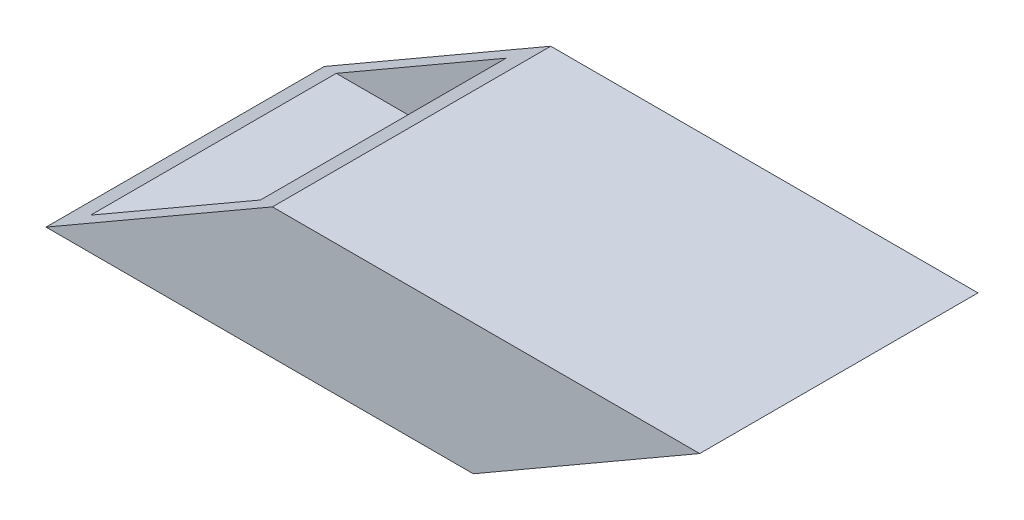
ISO-10303-21;
HEADER;
FILE_DESCRIPTION(('STEP AP214'),'2;1');
FILE_NAME('part.step','',(''),(''),'','','');
FILE_SCHEMA(('AUTOMOTIVE_DESIGN { 1 0 10303 214 1 1 1 1 }'));
ENDSEC;
DATA;
#1=APPLICATION_CONTEXT('core data for automotive mechanical design processes');
#2=APPLICATION_PROTOCOL_DEFINITION('international standard','automotive_design',2000,#1);
#3=PRODUCT_CONTEXT('',#1,'mechanical');
#4=PRODUCT('Part','Part','',(#3));
#5=PRODUCT_RELATED_PRODUCT_CATEGORY('part','',(#4));
#6=PRODUCT_DEFINITION_FORMATION('','',#4);
#7=PRODUCT_DEFINITION_CONTEXT('part definition',#1,'design');
#8=PRODUCT_DEFINITION('design','',#6,#7);
#9=PRODUCT_DEFINITION_SHAPE('','',#8);
#10=(LENGTH_UNIT() NAMED_UNIT(*) SI_UNIT(.MILLI.,.METRE.));
#11=(NAMED_UNIT(*) PLANE_ANGLE_UNIT() SI_UNIT($,.RADIAN.));
#12=(NAMED_UNIT(*) SI_UNIT($,.STERADIAN.) SOLID_ANGLE_UNIT());
#13=UNCERTAINTY_MEASURE_WITH_UNIT(LENGTH_MEASURE(1.E-05),#10,'distance_accuracy_value','');
#14=(GEOMETRIC_REPRESENTATION_CONTEXT(3) GLOBAL_UNCERTAINTY_ASSIGNED_CONTEXT((#13)) GLOBAL_UNIT_ASSIGNED_CONTEXT((#10,
#11,#12)) REPRESENTATION_CONTEXT('',''));
#15=CARTESIAN_POINT('',(0.,0.,0.));
#16=DIRECTION('',(0.,0.,1.));
#17=DIRECTION('',(1.,0.,0.));
#18=AXIS2_PLACEMENT_3D('',#15,#16,#17);
#19=CARTESIAN_POINT('',(100.,2.5,-40.07));
#20=DIRECTION('',(0.,0.,-1.));
#21=DIRECTION('',(-1.,0.,0.));
#22=AXIS2_PLACEMENT_3D('',#19,#20,#21);
#23=PLANE('',#22);
#24=DIRECTION('',(-1.,0.,0.));
#25=VECTOR('',#24,1.);
#26=CARTESIAN_POINT('',(100.,17.5,-40.07));
#27=LINE('',#26,#25);
#28=CARTESIAN_POINT('',(95.6698729810778,17.5,-40.07));
#29=VERTEX_POINT('',#28);
#30=CARTESIAN_POINT('',(30.3108891324558,17.5,-40.07));
#31=VERTEX_POINT('',#30);
#32=EDGE_CURVE('E141',#29,#31,#27,.T.);
#33=ORIENTED_EDGE('',*,*,#32,.T.);
#34=DIRECTION('',(-0.866025403784442,-0.499999999999995,0.));
#35=VECTOR('',#34,1.);
#36=CARTESIAN_POINT('',(76.0825317547311,43.9262701892216,-40.07));
#37=LINE('',#36,#35);
#38=CARTESIAN_POINT('',(4.33012701892226,2.5,-40.07));
#39=VERTEX_POINT('',#38);
#40=EDGE_CURVE('E11',#31,#39,#37,.T.);
#41=ORIENTED_EDGE('',*,*,#40,.T.);
#42=DIRECTION('',(-1.,0.,0.));
#43=VECTOR('',#42,1.);
#44=CARTESIAN_POINT('',(100.,2.5,-40.07));
#45=LINE('',#44,#43);
#46=CARTESIAN_POINT('',(69.6891108675447,2.5,-40.07));
#47=VERTEX_POINT('',#46);
#48=EDGE_CURVE('E143',#47,#39,#45,.T.);
#49=ORIENTED_EDGE('',*,*,#48,.F.);
#50=DIRECTION('',(0.866025403784438,0.500000000000001,0.));
#51=VECTOR('',#50,1.);
#52=CARTESIAN_POINT('',(92.4222777168862,15.625,-40.07));
#53=LINE('',#52,#51);
#54=EDGE_CURVE('E49',#47,#29,#53,.T.);
#55=ORIENTED_EDGE('',*,*,#54,.T.);
#56=EDGE_LOOP('',(#33,#41,#49,#55));
#57=FACE_BOUND('',#56,.T.);
#58=ADVANCED_FACE('F41',(#57),#23,.F.);
#59=CARTESIAN_POINT('',(100.,2.5,-2.5));
#60=DIRECTION('',(0.,-1.,0.));
#61=DIRECTION('',(0.,0.,-1.));
#62=AXIS2_PLACEMENT_3D('',#59,#60,#61);
#63=PLANE('',#62);
#64=ORIENTED_EDGE('',*,*,#48,.T.);
#65=DIRECTION('',(0.,0.,1.));
#66=VECTOR('',#65,1.);
#67=CARTESIAN_POINT('',(4.33012701892226,2.5,-2.5));
#68=LINE('',#67,#66);
#69=CARTESIAN_POINT('',(4.33012701892226,2.5,-2.5));
#70=VERTEX_POINT('',#69);
#71=EDGE_CURVE('E64',#39,#70,#68,.T.);
#72=ORIENTED_EDGE('',*,*,#71,.T.);
#73=DIRECTION('',(-1.,0.,0.));
#74=VECTOR('',#73,1.);
#75=CARTESIAN_POINT('',(100.,2.5,-2.5));
#76=LINE('',#75,#74);
#77=CARTESIAN_POINT('',(69.6891108675447,2.5,-2.5));
#78=VERTEX_POINT('',#77);
#79=EDGE_CURVE('E152',#78,#70,#76,.T.);
#80=ORIENTED_EDGE('',*,*,#79,.F.);
#81=DIRECTION('',(0.,0.,-1.));
#82=VECTOR('',#81,1.);
#83=CARTESIAN_POINT('',(69.6891108675447,2.5,-2.5));
#84=LINE('',#83,#82);
#85=EDGE_CURVE('E115',#78,#47,#84,.T.);
#86=ORIENTED_EDGE('',*,*,#85,.T.);
#87=EDGE_LOOP('',(#64,#72,#80,#86));
#88=FACE_BOUND('',#87,.T.);
#89=ADVANCED_FACE('F196',(#88),#63,.F.);
#90=CARTESIAN_POINT('',(100.,17.5,-2.49999999999999));
#91=DIRECTION('',(0.,0.,1.));
#92=DIRECTION('',(0.,-1.,0.));
#93=AXIS2_PLACEMENT_3D('',#90,#91,#92);
#94=PLANE('',#93);
#95=ORIENTED_EDGE('',*,*,#79,.T.);
#96=DIRECTION('',(0.866025403784442,0.499999999999995,0.));
#97=VECTOR('',#96,1.);
#98=CARTESIAN_POINT('',(82.5777222831143,47.6762701892216,-2.49999999999998));
#99=LINE('',#98,#97);
#100=CARTESIAN_POINT('',(30.3108891324558,17.5,-2.49999999999999));
#101=VERTEX_POINT('',#100);
#102=EDGE_CURVE('E154',#70,#101,#99,.T.);
#103=ORIENTED_EDGE('',*,*,#102,.T.);
#104=DIRECTION('',(-1.,0.,0.));
#105=VECTOR('',#104,1.);
#106=CARTESIAN_POINT('',(100.,17.5,-2.49999999999999));
#107=LINE('',#106,#105);
#108=CARTESIAN_POINT('',(95.6698729810778,17.5,-2.49999999999999));
#109=VERTEX_POINT('',#108);
#110=EDGE_CURVE('E159',#109,#101,#107,.T.);
#111=ORIENTED_EDGE('',*,*,#110,.F.);
#112=DIRECTION('',(-0.866025403784438,-0.500000000000001,0.));
#113=VECTOR('',#112,1.);
#114=CARTESIAN_POINT('',(98.9174682452694,19.375,-2.49999999999999));
#115=LINE('',#114,#113);
#116=EDGE_CURVE('E168',#109,#78,#115,.T.);
#117=ORIENTED_EDGE('',*,*,#116,.T.);
#118=EDGE_LOOP('',(#95,#103,#111,#117));
#119=FACE_BOUND('',#118,.T.);
#120=ADVANCED_FACE('F192',(#119),#94,.F.);
#121=CARTESIAN_POINT('',(100.,17.5,-40.07));
#122=DIRECTION('',(0.,1.,0.));
#123=DIRECTION('',(0.,0.,1.));
#124=AXIS2_PLACEMENT_3D('',#121,#122,#123);
#125=PLANE('',#124);
#126=ORIENTED_EDGE('',*,*,#110,.T.);
#127=DIRECTION('',(0.,0.,-1.));
#128=VECTOR('',#127,1.);
#129=CARTESIAN_POINT('',(30.3108891324558,17.5,-40.07));
#130=LINE('',#129,#128);
#131=EDGE_CURVE('E150',#101,#31,#130,.T.);
#132=ORIENTED_EDGE('',*,*,#131,.T.);
#133=ORIENTED_EDGE('',*,*,#32,.F.);
#134=DIRECTION('',(0.,0.,1.));
#135=VECTOR('',#134,1.);
#136=CARTESIAN_POINT('',(95.6698729810778,17.5,-40.07));
#137=LINE('',#136,#135);
#138=EDGE_CURVE('E56',#29,#109,#137,.T.);
#139=ORIENTED_EDGE('',*,*,#138,.T.);
#140=EDGE_LOOP('',(#126,#132,#133,#139));
#141=FACE_BOUND('',#140,.T.);
#142=ADVANCED_FACE('F148',(#141),#125,.F.);
#143=CARTESIAN_POINT('',(100.,20.,-42.57));
#144=DIRECTION('',(-0.500000000000001,0.866025403784438,0.));
#145=DIRECTION('',(-0.866025403784438,-0.500000000000001,0.));
#146=AXIS2_PLACEMENT_3D('',#143,#144,#145);
#147=PLANE('',#146);
#148=DIRECTION('',(-0.866025403784438,-0.500000000000001,0.));
#149=VECTOR('',#148,1.);
#150=CARTESIAN_POINT('',(100.,20.,0.));
#151=LINE('',#150,#149);
#152=CARTESIAN_POINT('',(100.,20.,0.));
#153=VERTEX_POINT('',#152);
#154=CARTESIAN_POINT('',(65.3589838486226,0.,0.));
#155=VERTEX_POINT('',#154);
#156=EDGE_CURVE('E174',#153,#155,#151,.T.);
#157=ORIENTED_EDGE('',*,*,#156,.T.);
#158=DIRECTION('',(0.,0.,1.));
#159=VECTOR('',#158,1.);
#160=CARTESIAN_POINT('',(65.3589838486226,0.,-42.57));
#161=LINE('',#160,#159);
#162=CARTESIAN_POINT('',(65.3589838486226,0.,-42.57));
#163=VERTEX_POINT('',#162);
#164=EDGE_CURVE('E175',#163,#155,#161,.T.);
#165=ORIENTED_EDGE('',*,*,#164,.F.);
#166=DIRECTION('',(-0.866025403784438,-0.500000000000001,0.));
#167=VECTOR('',#166,1.);
#168=CARTESIAN_POINT('',(100.,20.,-42.57));
#169=LINE('',#168,#167);
#170=CARTESIAN_POINT('',(100.,20.,-42.57));
#171=VERTEX_POINT('',#170);
#172=EDGE_CURVE('E172',#171,#163,#169,.T.);
#173=ORIENTED_EDGE('',*,*,#172,.F.);
#174=DIRECTION('',(0.,0.,1.));
#175=VECTOR('',#174,1.);
#176=CARTESIAN_POINT('',(100.,20.,0.));
#177=LINE('',#176,#175);
#178=EDGE_CURVE('E128',#171,#153,#177,.T.);
#179=ORIENTED_EDGE('',*,*,#178,.T.);
#180=EDGE_LOOP('',(#157,#165,#173,#179));
#181=FACE_BOUND('',#180,.T.);
#182=ORIENTED_EDGE('',*,*,#54,.F.);
#183=ORIENTED_EDGE('',*,*,#85,.F.);
#184=ORIENTED_EDGE('',*,*,#116,.F.);
#185=ORIENTED_EDGE('',*,*,#138,.F.);
#186=EDGE_LOOP('',(#182,#183,#184,#185));
#187=FACE_BOUND('',#186,.T.);
#188=ADVANCED_FACE('F184',(#181,#187),#147,.F.);
#189=CARTESIAN_POINT('',(0.,0.,-42.57));
#190=DIRECTION('',(0.499999999999995,-0.866025403784441,0.));
#191=DIRECTION('',(0.866025403784442,0.499999999999995,0.));
#192=AXIS2_PLACEMENT_3D('',#189,#190,#191);
#193=PLANE('',#192);
#194=DIRECTION('',(0.866025403784442,0.499999999999995,0.));
#195=VECTOR('',#194,1.);
#196=CARTESIAN_POINT('',(0.,0.,0.));
#197=LINE('',#196,#195);
#198=CARTESIAN_POINT('',(0.,0.,0.));
#199=VERTEX_POINT('',#198);
#200=CARTESIAN_POINT('',(34.641016151378,20.,0.));
#201=VERTEX_POINT('',#200);
#202=EDGE_CURVE('E110',#199,#201,#197,.T.);
#203=ORIENTED_EDGE('',*,*,#202,.T.);
#204=DIRECTION('',(0.,0.,1.));
#205=VECTOR('',#204,1.);
#206=CARTESIAN_POINT('',(34.641016151378,20.,-42.57));
#207=LINE('',#206,#205);
#208=CARTESIAN_POINT('',(34.641016151378,20.,-42.57));
#209=VERTEX_POINT('',#208);
#210=EDGE_CURVE('E104',#209,#201,#207,.T.);
#211=ORIENTED_EDGE('',*,*,#210,.F.);
#212=DIRECTION('',(0.866025403784442,0.499999999999995,0.));
#213=VECTOR('',#212,1.);
#214=CARTESIAN_POINT('',(0.,0.,-42.57));
#215=LINE('',#214,#213);
#216=CARTESIAN_POINT('',(0.,0.,-42.57));
#217=VERTEX_POINT('',#216);
#218=EDGE_CURVE('E107',#217,#209,#215,.T.);
#219=ORIENTED_EDGE('',*,*,#218,.F.);
#220=DIRECTION('',(0.,0.,-1.));
#221=VECTOR('',#220,1.);
#222=CARTESIAN_POINT('',(0.,0.,0.));
#223=LINE('',#222,#221);
#224=EDGE_CURVE('E158',#199,#217,#223,.T.);
#225=ORIENTED_EDGE('',*,*,#224,.F.);
#226=EDGE_LOOP('',(#203,#211,#219,#225));
#227=FACE_BOUND('',#226,.T.);
#228=ORIENTED_EDGE('',*,*,#102,.F.);
#229=ORIENTED_EDGE('',*,*,#71,.F.);
#230=ORIENTED_EDGE('',*,*,#40,.F.);
#231=ORIENTED_EDGE('',*,*,#131,.F.);
#232=EDGE_LOOP('',(#228,#229,#230,#231));
#233=FACE_BOUND('',#232,.T.);
#234=ADVANCED_FACE('F106',(#227,#233),#193,.F.);
#235=CARTESIAN_POINT('',(100.,0.,0.));
#236=DIRECTION('',(0.,0.,-1.));
#237=DIRECTION('',(0.,1.,0.));
#238=AXIS2_PLACEMENT_3D('',#235,#236,#237);
#239=PLANE('',#238);
#240=DIRECTION('',(-1.,0.,0.));
#241=VECTOR('',#240,1.);
#242=CARTESIAN_POINT('',(100.,20.,0.));
#243=LINE('',#242,#241);
#244=EDGE_CURVE('E129',#153,#201,#243,.T.);
#245=ORIENTED_EDGE('',*,*,#244,.T.);
#246=ORIENTED_EDGE('',*,*,#202,.F.);
#247=DIRECTION('',(-1.,0.,0.));
#248=VECTOR('',#247,1.);
#249=CARTESIAN_POINT('',(100.,0.,0.));
#250=LINE('',#249,#248);
#251=EDGE_CURVE('E131',#155,#199,#250,.T.);
#252=ORIENTED_EDGE('',*,*,#251,.F.);
#253=ORIENTED_EDGE('',*,*,#156,.F.);
#254=EDGE_LOOP('',(#245,#246,#252,#253));
#255=FACE_BOUND('',#254,.T.);
#256=ADVANCED_FACE('F43',(#255),#239,.F.);
#257=CARTESIAN_POINT('',(100.,0.,0.));
#258=DIRECTION('',(0.,1.,0.));
#259=DIRECTION('',(0.,0.,1.));
#260=AXIS2_PLACEMENT_3D('',#257,#258,#259);
#261=PLANE('',#260);
#262=DIRECTION('',(-1.,0.,0.));
#263=VECTOR('',#262,1.);
#264=CARTESIAN_POINT('',(100.,0.,-42.57));
#265=LINE('',#264,#263);
#266=EDGE_CURVE('E124',#163,#217,#265,.T.);
#267=ORIENTED_EDGE('',*,*,#266,.F.);
#268=ORIENTED_EDGE('',*,*,#164,.T.);
#269=ORIENTED_EDGE('',*,*,#251,.T.);
#270=ORIENTED_EDGE('',*,*,#224,.T.);
#271=EDGE_LOOP('',(#267,#268,#269,#270));
#272=FACE_BOUND('',#271,.T.);
#273=ADVANCED_FACE('F180',(#272),#261,.F.);
#274=CARTESIAN_POINT('',(100.,0.,-42.57));
#275=DIRECTION('',(0.,0.,1.));
#276=DIRECTION('',(0.,-1.,0.));
#277=AXIS2_PLACEMENT_3D('',#274,#275,#276);
#278=PLANE('',#277);
#279=ORIENTED_EDGE('',*,*,#266,.T.);
#280=ORIENTED_EDGE('',*,*,#218,.T.);
#281=DIRECTION('',(-1.,0.,0.));
#282=VECTOR('',#281,1.);
#283=CARTESIAN_POINT('',(100.,20.,-42.57));
#284=LINE('',#283,#282);
#285=EDGE_CURVE('E121',#171,#209,#284,.T.);
#286=ORIENTED_EDGE('',*,*,#285,.F.);
#287=ORIENTED_EDGE('',*,*,#172,.T.);
#288=EDGE_LOOP('',(#279,#280,#286,#287));
#289=FACE_BOUND('',#288,.T.);
#290=ADVANCED_FACE('F119',(#289),#278,.F.);
#291=CARTESIAN_POINT('',(100.,20.,0.));
#292=DIRECTION('',(0.,-1.,0.));
#293=DIRECTION('',(0.,0.,-1.));
#294=AXIS2_PLACEMENT_3D('',#291,#292,#293);
#295=PLANE('',#294);
#296=ORIENTED_EDGE('',*,*,#285,.T.);
#297=ORIENTED_EDGE('',*,*,#210,.T.);
#298=ORIENTED_EDGE('',*,*,#244,.F.);
#299=ORIENTED_EDGE('',*,*,#178,.F.);
#300=EDGE_LOOP('',(#296,#297,#298,#299));
#301=FACE_BOUND('',#300,.T.);
#302=ADVANCED_FACE('F127',(#301),#295,.F.);
#303=CLOSED_SHELL('',(#58,#89,#120,#142,#188,#234,#256,#273,#290,#302));
#304=MANIFOLD_SOLID_BREP('B2',#303);
#305=ADVANCED_BREP_SHAPE_REPRESENTATION('',(#18,#304),#14);
#306=SHAPE_DEFINITION_REPRESENTATION(#9,#305);
ENDSEC;
END-ISO-10303-21;
